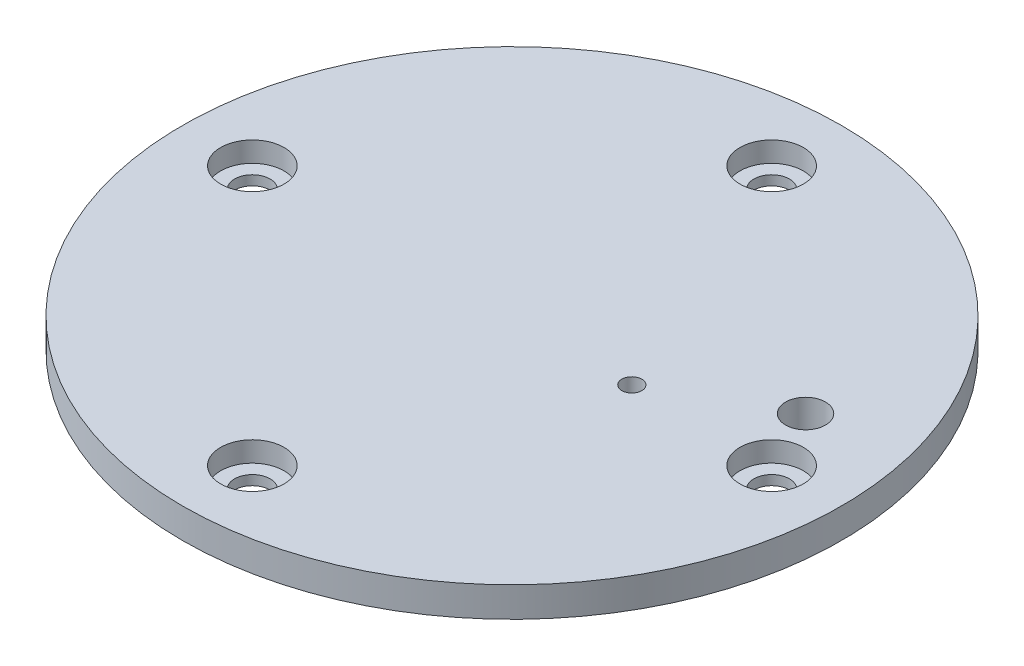
ISO-10303-21;
HEADER;
FILE_DESCRIPTION(('STEP AP214'),'2;1');
FILE_NAME('part.step','',(''),(''),'','','');
FILE_SCHEMA(('AUTOMOTIVE_DESIGN { 1 0 10303 214 1 1 1 1 }'));
ENDSEC;
DATA;
#1=APPLICATION_CONTEXT('core data for automotive mechanical design processes');
#2=APPLICATION_PROTOCOL_DEFINITION('international standard','automotive_design',2000,#1);
#3=PRODUCT_CONTEXT('',#1,'mechanical');
#4=PRODUCT('Part','Part','',(#3));
#5=PRODUCT_RELATED_PRODUCT_CATEGORY('part','',(#4));
#6=PRODUCT_DEFINITION_FORMATION('','',#4);
#7=PRODUCT_DEFINITION_CONTEXT('part definition',#1,'design');
#8=PRODUCT_DEFINITION('design','',#6,#7);
#9=PRODUCT_DEFINITION_SHAPE('','',#8);
#10=(LENGTH_UNIT() NAMED_UNIT(*) SI_UNIT(.MILLI.,.METRE.));
#11=(NAMED_UNIT(*) PLANE_ANGLE_UNIT() SI_UNIT($,.RADIAN.));
#12=(NAMED_UNIT(*) SI_UNIT($,.STERADIAN.) SOLID_ANGLE_UNIT());
#13=UNCERTAINTY_MEASURE_WITH_UNIT(LENGTH_MEASURE(1.E-05),#10,'distance_accuracy_value','');
#14=(GEOMETRIC_REPRESENTATION_CONTEXT(3) GLOBAL_UNCERTAINTY_ASSIGNED_CONTEXT((#13)) GLOBAL_UNIT_ASSIGNED_CONTEXT((#10,
#11,#12)) REPRESENTATION_CONTEXT('',''));
#15=CARTESIAN_POINT('',(0.,0.,0.));
#16=DIRECTION('',(0.,0.,1.));
#17=DIRECTION('',(1.,0.,0.));
#18=AXIS2_PLACEMENT_3D('',#15,#16,#17);
#19=CARTESIAN_POINT('',(0.,1.5,0.));
#20=DIRECTION('',(0.,-1.,0.));
#21=DIRECTION('',(0.,0.,-1.));
#22=AXIS2_PLACEMENT_3D('',#19,#20,#21);
#23=CYLINDRICAL_SURFACE('',#22,16.5);
#24=CARTESIAN_POINT('',(0.,1.5,0.));
#25=DIRECTION('',(0.,1.,0.));
#26=DIRECTION('',(0.,0.,1.));
#27=AXIS2_PLACEMENT_3D('',#24,#25,#26);
#28=CIRCLE('',#27,16.5);
#29=CARTESIAN_POINT('',(0.,1.5,16.5));
#30=VERTEX_POINT('',#29);
#31=EDGE_CURVE('E10',#30,#30,#28,.T.);
#32=ORIENTED_EDGE('',*,*,#31,.F.);
#33=EDGE_LOOP('',(#32));
#34=FACE_BOUND('',#33,.T.);
#35=CARTESIAN_POINT('',(0.,0.,0.));
#36=DIRECTION('',(0.,1.,0.));
#37=DIRECTION('',(0.,0.,1.));
#38=AXIS2_PLACEMENT_3D('',#35,#36,#37);
#39=CIRCLE('',#38,16.5);
#40=CARTESIAN_POINT('',(0.,0.,16.5));
#41=VERTEX_POINT('',#40);
#42=EDGE_CURVE('E36',#41,#41,#39,.T.);
#43=ORIENTED_EDGE('',*,*,#42,.T.);
#44=EDGE_LOOP('',(#43));
#45=FACE_BOUND('',#44,.T.);
#46=ADVANCED_FACE('F33',(#34,#45),#23,.T.);
#47=CARTESIAN_POINT('',(0.,1.5,0.));
#48=DIRECTION('',(0.,1.,0.));
#49=DIRECTION('',(0.,0.,1.));
#50=AXIS2_PLACEMENT_3D('',#47,#48,#49);
#51=PLANE('',#50);
#52=CARTESIAN_POINT('',(11.5911099154688,1.5,-3.10582854123018));
#53=DIRECTION('',(0.,1.,0.));
#54=DIRECTION('',(0.,0.,1.));
#55=AXIS2_PLACEMENT_3D('',#52,#53,#54);
#56=CIRCLE('',#55,1.00000000000001);
#57=CARTESIAN_POINT('',(11.5911099154688,1.5,-2.10582854123017));
#58=VERTEX_POINT('',#57);
#59=EDGE_CURVE('E96',#58,#58,#56,.T.);
#60=ORIENTED_EDGE('',*,*,#59,.F.);
#61=EDGE_LOOP('',(#60));
#62=FACE_BOUND('',#61,.T.);
#63=CARTESIAN_POINT('',(6.,1.5,0.));
#64=DIRECTION('',(0.,-1.,0.));
#65=DIRECTION('',(0.,0.,-1.));
#66=AXIS2_PLACEMENT_3D('',#63,#64,#65);
#67=CIRCLE('',#66,0.500000000000001);
#68=CARTESIAN_POINT('',(6.,1.5,-0.500000000000001));
#69=VERTEX_POINT('',#68);
#70=EDGE_CURVE('E70',#69,#69,#67,.T.);
#71=ORIENTED_EDGE('',*,*,#70,.T.);
#72=EDGE_LOOP('',(#71));
#73=FACE_BOUND('',#72,.T.);
#74=CARTESIAN_POINT('',(0.,1.5,13.));
#75=DIRECTION('',(0.,1.,0.));
#76=DIRECTION('',(1.,0.,0.));
#77=AXIS2_PLACEMENT_3D('',#74,#75,#76);
#78=CIRCLE('',#77,1.5875);
#79=CARTESIAN_POINT('',(1.58750000000005,1.5,13.));
#80=VERTEX_POINT('',#79);
#81=EDGE_CURVE('E74',#80,#80,#78,.T.);
#82=ORIENTED_EDGE('',*,*,#81,.F.);
#83=EDGE_LOOP('',(#82));
#84=FACE_BOUND('',#83,.T.);
#85=CARTESIAN_POINT('',(13.,1.5,0.));
#86=DIRECTION('',(0.,1.,0.));
#87=DIRECTION('',(0.,0.,-1.));
#88=AXIS2_PLACEMENT_3D('',#85,#86,#87);
#89=CIRCLE('',#88,1.5875);
#90=CARTESIAN_POINT('',(13.,1.5,-1.5875));
#91=VERTEX_POINT('',#90);
#92=EDGE_CURVE('E60',#91,#91,#89,.T.);
#93=ORIENTED_EDGE('',*,*,#92,.F.);
#94=EDGE_LOOP('',(#93));
#95=FACE_BOUND('',#94,.T.);
#96=CARTESIAN_POINT('',(-1.36167772214882E-13,1.5,-13.));
#97=DIRECTION('',(0.,1.,0.));
#98=DIRECTION('',(-1.,0.,0.));
#99=AXIS2_PLACEMENT_3D('',#96,#97,#98);
#100=CIRCLE('',#99,1.5875);
#101=CARTESIAN_POINT('',(-1.58750000000014,1.5,-13.));
#102=VERTEX_POINT('',#101);
#103=EDGE_CURVE('E67',#102,#102,#100,.T.);
#104=ORIENTED_EDGE('',*,*,#103,.F.);
#105=EDGE_LOOP('',(#104));
#106=FACE_BOUND('',#105,.T.);
#107=CARTESIAN_POINT('',(-13.,1.5,0.));
#108=DIRECTION('',(0.,1.,0.));
#109=DIRECTION('',(0.,0.,1.));
#110=AXIS2_PLACEMENT_3D('',#107,#108,#109);
#111=CIRCLE('',#110,1.5875);
#112=CARTESIAN_POINT('',(-13.,1.5,1.5875));
#113=VERTEX_POINT('',#112);
#114=EDGE_CURVE('E53',#113,#113,#111,.T.);
#115=ORIENTED_EDGE('',*,*,#114,.F.);
#116=EDGE_LOOP('',(#115));
#117=FACE_BOUND('',#116,.T.);
#118=ORIENTED_EDGE('',*,*,#31,.T.);
#119=EDGE_LOOP('',(#118));
#120=FACE_BOUND('',#119,.T.);
#121=ADVANCED_FACE('F120',(#62,#73,#84,#95,#106,#117,#120),#51,.T.);
#122=CARTESIAN_POINT('',(0.,0.,0.));
#123=DIRECTION('',(0.,1.,0.));
#124=DIRECTION('',(0.,0.,1.));
#125=AXIS2_PLACEMENT_3D('',#122,#123,#124);
#126=PLANE('',#125);
#127=CARTESIAN_POINT('',(11.5911099154688,0.,-3.10582854123018));
#128=DIRECTION('',(0.,1.,0.));
#129=DIRECTION('',(0.,0.,1.));
#130=AXIS2_PLACEMENT_3D('',#127,#128,#129);
#131=CIRCLE('',#130,1.00000000000001);
#132=CARTESIAN_POINT('',(11.5911099154688,0.,-2.10582854123017));
#133=VERTEX_POINT('',#132);
#134=EDGE_CURVE('E101',#133,#133,#131,.T.);
#135=ORIENTED_EDGE('',*,*,#134,.T.);
#136=EDGE_LOOP('',(#135));
#137=FACE_BOUND('',#136,.T.);
#138=CARTESIAN_POINT('',(6.,0.,0.));
#139=DIRECTION('',(0.,-1.,0.));
#140=DIRECTION('',(0.,0.,-1.));
#141=AXIS2_PLACEMENT_3D('',#138,#139,#140);
#142=CIRCLE('',#141,0.500000000000001);
#143=CARTESIAN_POINT('',(6.,0.,-0.500000000000001));
#144=VERTEX_POINT('',#143);
#145=EDGE_CURVE('E93',#144,#144,#142,.T.);
#146=ORIENTED_EDGE('',*,*,#145,.F.);
#147=EDGE_LOOP('',(#146));
#148=FACE_BOUND('',#147,.T.);
#149=CARTESIAN_POINT('',(0.,0.,13.));
#150=DIRECTION('',(0.,1.,0.));
#151=DIRECTION('',(1.,0.,0.));
#152=AXIS2_PLACEMENT_3D('',#149,#150,#151);
#153=CIRCLE('',#152,0.888999999999999);
#154=CARTESIAN_POINT('',(0.889000000000045,0.,13.));
#155=VERTEX_POINT('',#154);
#156=EDGE_CURVE('E88',#155,#155,#153,.T.);
#157=ORIENTED_EDGE('',*,*,#156,.T.);
#158=EDGE_LOOP('',(#157));
#159=FACE_BOUND('',#158,.T.);
#160=CARTESIAN_POINT('',(13.,0.,0.));
#161=DIRECTION('',(0.,1.,0.));
#162=DIRECTION('',(0.,0.,-1.));
#163=AXIS2_PLACEMENT_3D('',#160,#161,#162);
#164=CIRCLE('',#163,0.888999999999999);
#165=CARTESIAN_POINT('',(13.,0.,-0.888999999999999));
#166=VERTEX_POINT('',#165);
#167=EDGE_CURVE('E78',#166,#166,#164,.T.);
#168=ORIENTED_EDGE('',*,*,#167,.T.);
#169=EDGE_LOOP('',(#168));
#170=FACE_BOUND('',#169,.T.);
#171=CARTESIAN_POINT('',(-1.36167772214882E-13,0.,-13.));
#172=DIRECTION('',(0.,1.,0.));
#173=DIRECTION('',(-1.,0.,0.));
#174=AXIS2_PLACEMENT_3D('',#171,#172,#173);
#175=CIRCLE('',#174,0.888999999999999);
#176=CARTESIAN_POINT('',(-0.889000000000135,0.,-13.));
#177=VERTEX_POINT('',#176);
#178=EDGE_CURVE('E64',#177,#177,#175,.T.);
#179=ORIENTED_EDGE('',*,*,#178,.T.);
#180=EDGE_LOOP('',(#179));
#181=FACE_BOUND('',#180,.T.);
#182=CARTESIAN_POINT('',(-13.,0.,0.));
#183=DIRECTION('',(0.,1.,0.));
#184=DIRECTION('',(0.,0.,1.));
#185=AXIS2_PLACEMENT_3D('',#182,#183,#184);
#186=CIRCLE('',#185,0.888999999999999);
#187=CARTESIAN_POINT('',(-13.,0.,0.888999999999999));
#188=VERTEX_POINT('',#187);
#189=EDGE_CURVE('E43',#188,#188,#186,.T.);
#190=ORIENTED_EDGE('',*,*,#189,.T.);
#191=EDGE_LOOP('',(#190));
#192=FACE_BOUND('',#191,.T.);
#193=ORIENTED_EDGE('',*,*,#42,.F.);
#194=EDGE_LOOP('',(#193));
#195=FACE_BOUND('',#194,.T.);
#196=ADVANCED_FACE('F105',(#137,#148,#159,#170,#181,#192,#195),#126,.F.);
#197=CARTESIAN_POINT('',(-13.,1.5,0.));
#198=DIRECTION('',(0.,1.,0.));
#199=DIRECTION('',(0.,0.,1.));
#200=AXIS2_PLACEMENT_3D('',#197,#198,#199);
#201=CYLINDRICAL_SURFACE('',#200,0.888999999999999);
#202=ORIENTED_EDGE('',*,*,#189,.F.);
#203=EDGE_LOOP('',(#202));
#204=FACE_BOUND('',#203,.T.);
#205=CARTESIAN_POINT('',(-13.,0.484,0.));
#206=DIRECTION('',(0.,1.,0.));
#207=DIRECTION('',(0.,0.,1.));
#208=AXIS2_PLACEMENT_3D('',#205,#206,#207);
#209=CIRCLE('',#208,0.888999999999999);
#210=CARTESIAN_POINT('',(-13.,0.484,0.888999999999999));
#211=VERTEX_POINT('',#210);
#212=EDGE_CURVE('E47',#211,#211,#209,.T.);
#213=ORIENTED_EDGE('',*,*,#212,.T.);
#214=EDGE_LOOP('',(#213));
#215=FACE_BOUND('',#214,.T.);
#216=ADVANCED_FACE('F131',(#204,#215),#201,.F.);
#217=CARTESIAN_POINT('',(-12.111,0.484,0.));
#218=DIRECTION('',(0.,-1.,0.));
#219=DIRECTION('',(0.,0.,-1.));
#220=AXIS2_PLACEMENT_3D('',#217,#218,#219);
#221=PLANE('',#220);
#222=ORIENTED_EDGE('',*,*,#212,.F.);
#223=EDGE_LOOP('',(#222));
#224=FACE_BOUND('',#223,.T.);
#225=CARTESIAN_POINT('',(-13.,0.484,0.));
#226=DIRECTION('',(0.,1.,0.));
#227=DIRECTION('',(0.,0.,1.));
#228=AXIS2_PLACEMENT_3D('',#225,#226,#227);
#229=CIRCLE('',#228,1.5875);
#230=CARTESIAN_POINT('',(-13.,0.484,1.5875));
#231=VERTEX_POINT('',#230);
#232=EDGE_CURVE('E50',#231,#231,#229,.T.);
#233=ORIENTED_EDGE('',*,*,#232,.T.);
#234=EDGE_LOOP('',(#233));
#235=FACE_BOUND('',#234,.T.);
#236=ADVANCED_FACE('F135',(#224,#235),#221,.F.);
#237=CARTESIAN_POINT('',(-13.,1.5,0.));
#238=DIRECTION('',(0.,1.,0.));
#239=DIRECTION('',(0.,0.,1.));
#240=AXIS2_PLACEMENT_3D('',#237,#238,#239);
#241=CYLINDRICAL_SURFACE('',#240,1.5875);
#242=ORIENTED_EDGE('',*,*,#232,.F.);
#243=EDGE_LOOP('',(#242));
#244=FACE_BOUND('',#243,.T.);
#245=ORIENTED_EDGE('',*,*,#114,.T.);
#246=EDGE_LOOP('',(#245));
#247=FACE_BOUND('',#246,.T.);
#248=ADVANCED_FACE('F141',(#244,#247),#241,.F.);
#249=CARTESIAN_POINT('',(-1.36167772214882E-13,1.5,-13.));
#250=DIRECTION('',(0.,1.,0.));
#251=DIRECTION('',(-1.,0.,0.));
#252=AXIS2_PLACEMENT_3D('',#249,#250,#251);
#253=CYLINDRICAL_SURFACE('',#252,0.888999999999999);
#254=ORIENTED_EDGE('',*,*,#178,.F.);
#255=EDGE_LOOP('',(#254));
#256=FACE_BOUND('',#255,.T.);
#257=CARTESIAN_POINT('',(-1.36167772214882E-13,0.484,-13.));
#258=DIRECTION('',(0.,1.,0.));
#259=DIRECTION('',(-1.,0.,0.));
#260=AXIS2_PLACEMENT_3D('',#257,#258,#259);
#261=CIRCLE('',#260,0.888999999999999);
#262=CARTESIAN_POINT('',(-0.889000000000135,0.484,-13.));
#263=VERTEX_POINT('',#262);
#264=EDGE_CURVE('E57',#263,#263,#261,.T.);
#265=ORIENTED_EDGE('',*,*,#264,.T.);
#266=EDGE_LOOP('',(#265));
#267=FACE_BOUND('',#266,.T.);
#268=ADVANCED_FACE('F145',(#256,#267),#253,.F.);
#269=CARTESIAN_POINT('',(-1.26855991484188E-13,0.484,-12.111));
#270=DIRECTION('',(0.,-1.,0.));
#271=DIRECTION('',(1.,0.,0.));
#272=AXIS2_PLACEMENT_3D('',#269,#270,#271);
#273=PLANE('',#272);
#274=ORIENTED_EDGE('',*,*,#264,.F.);
#275=EDGE_LOOP('',(#274));
#276=FACE_BOUND('',#275,.T.);
#277=CARTESIAN_POINT('',(-1.36167772214882E-13,0.484,-13.));
#278=DIRECTION('',(0.,1.,0.));
#279=DIRECTION('',(-1.,0.,0.));
#280=AXIS2_PLACEMENT_3D('',#277,#278,#279);
#281=CIRCLE('',#280,1.5875);
#282=CARTESIAN_POINT('',(-1.58750000000013,0.484,-13.));
#283=VERTEX_POINT('',#282);
#284=EDGE_CURVE('E61',#283,#283,#281,.T.);
#285=ORIENTED_EDGE('',*,*,#284,.T.);
#286=EDGE_LOOP('',(#285));
#287=FACE_BOUND('',#286,.T.);
#288=ADVANCED_FACE('F149',(#276,#287),#273,.F.);
#289=CARTESIAN_POINT('',(-1.36167772214882E-13,1.5,-13.));
#290=DIRECTION('',(0.,1.,0.));
#291=DIRECTION('',(-1.,0.,0.));
#292=AXIS2_PLACEMENT_3D('',#289,#290,#291);
#293=CYLINDRICAL_SURFACE('',#292,1.5875);
#294=ORIENTED_EDGE('',*,*,#284,.F.);
#295=EDGE_LOOP('',(#294));
#296=FACE_BOUND('',#295,.T.);
#297=ORIENTED_EDGE('',*,*,#103,.T.);
#298=EDGE_LOOP('',(#297));
#299=FACE_BOUND('',#298,.T.);
#300=ADVANCED_FACE('F153',(#296,#299),#293,.F.);
#301=CARTESIAN_POINT('',(13.,1.5,0.));
#302=DIRECTION('',(0.,1.,0.));
#303=DIRECTION('',(0.,0.,-1.));
#304=AXIS2_PLACEMENT_3D('',#301,#302,#303);
#305=CYLINDRICAL_SURFACE('',#304,0.888999999999999);
#306=ORIENTED_EDGE('',*,*,#167,.F.);
#307=EDGE_LOOP('',(#306));
#308=FACE_BOUND('',#307,.T.);
#309=CARTESIAN_POINT('',(13.,0.484,0.));
#310=DIRECTION('',(0.,1.,0.));
#311=DIRECTION('',(0.,0.,-1.));
#312=AXIS2_PLACEMENT_3D('',#309,#310,#311);
#313=CIRCLE('',#312,0.888999999999999);
#314=CARTESIAN_POINT('',(13.,0.484,-0.888999999999999));
#315=VERTEX_POINT('',#314);
#316=EDGE_CURVE('E71',#315,#315,#313,.T.);
#317=ORIENTED_EDGE('',*,*,#316,.T.);
#318=EDGE_LOOP('',(#317));
#319=FACE_BOUND('',#318,.T.);
#320=ADVANCED_FACE('F157',(#308,#319),#305,.F.);
#321=CARTESIAN_POINT('',(12.111,0.484,0.));
#322=DIRECTION('',(0.,-1.,0.));
#323=DIRECTION('',(0.,0.,1.));
#324=AXIS2_PLACEMENT_3D('',#321,#322,#323);
#325=PLANE('',#324);
#326=ORIENTED_EDGE('',*,*,#316,.F.);
#327=EDGE_LOOP('',(#326));
#328=FACE_BOUND('',#327,.T.);
#329=CARTESIAN_POINT('',(13.,0.484,0.));
#330=DIRECTION('',(0.,1.,0.));
#331=DIRECTION('',(0.,0.,-1.));
#332=AXIS2_PLACEMENT_3D('',#329,#330,#331);
#333=CIRCLE('',#332,1.5875);
#334=CARTESIAN_POINT('',(13.,0.484,-1.5875));
#335=VERTEX_POINT('',#334);
#336=EDGE_CURVE('E75',#335,#335,#333,.T.);
#337=ORIENTED_EDGE('',*,*,#336,.T.);
#338=EDGE_LOOP('',(#337));
#339=FACE_BOUND('',#338,.T.);
#340=ADVANCED_FACE('F161',(#328,#339),#325,.F.);
#341=CARTESIAN_POINT('',(13.,1.5,0.));
#342=DIRECTION('',(0.,1.,0.));
#343=DIRECTION('',(0.,0.,-1.));
#344=AXIS2_PLACEMENT_3D('',#341,#342,#343);
#345=CYLINDRICAL_SURFACE('',#344,1.5875);
#346=ORIENTED_EDGE('',*,*,#336,.F.);
#347=EDGE_LOOP('',(#346));
#348=FACE_BOUND('',#347,.T.);
#349=ORIENTED_EDGE('',*,*,#92,.T.);
#350=EDGE_LOOP('',(#349));
#351=FACE_BOUND('',#350,.T.);
#352=ADVANCED_FACE('F165',(#348,#351),#345,.F.);
#353=CARTESIAN_POINT('',(0.,1.5,13.));
#354=DIRECTION('',(0.,1.,0.));
#355=DIRECTION('',(1.,0.,0.));
#356=AXIS2_PLACEMENT_3D('',#353,#354,#355);
#357=CYLINDRICAL_SURFACE('',#356,0.888999999999999);
#358=ORIENTED_EDGE('',*,*,#156,.F.);
#359=EDGE_LOOP('',(#358));
#360=FACE_BOUND('',#359,.T.);
#361=CARTESIAN_POINT('',(0.,0.484,13.));
#362=DIRECTION('',(0.,1.,0.));
#363=DIRECTION('',(1.,0.,0.));
#364=AXIS2_PLACEMENT_3D('',#361,#362,#363);
#365=CIRCLE('',#364,0.888999999999999);
#366=CARTESIAN_POINT('',(0.889000000000045,0.484,13.));
#367=VERTEX_POINT('',#366);
#368=EDGE_CURVE('E56',#367,#367,#365,.T.);
#369=ORIENTED_EDGE('',*,*,#368,.T.);
#370=EDGE_LOOP('',(#369));
#371=FACE_BOUND('',#370,.T.);
#372=ADVANCED_FACE('F169',(#360,#371),#357,.F.);
#373=CARTESIAN_POINT('',(0.,0.484,12.111));
#374=DIRECTION('',(0.,-1.,0.));
#375=DIRECTION('',(-1.,0.,0.));
#376=AXIS2_PLACEMENT_3D('',#373,#374,#375);
#377=PLANE('',#376);
#378=ORIENTED_EDGE('',*,*,#368,.F.);
#379=EDGE_LOOP('',(#378));
#380=FACE_BOUND('',#379,.T.);
#381=CARTESIAN_POINT('',(0.,0.484,13.));
#382=DIRECTION('',(0.,1.,0.));
#383=DIRECTION('',(1.,0.,0.));
#384=AXIS2_PLACEMENT_3D('',#381,#382,#383);
#385=CIRCLE('',#384,1.5875);
#386=CARTESIAN_POINT('',(1.58750000000004,0.484,13.));
#387=VERTEX_POINT('',#386);
#388=EDGE_CURVE('E85',#387,#387,#385,.T.);
#389=ORIENTED_EDGE('',*,*,#388,.T.);
#390=EDGE_LOOP('',(#389));
#391=FACE_BOUND('',#390,.T.);
#392=ADVANCED_FACE('F173',(#380,#391),#377,.F.);
#393=CARTESIAN_POINT('',(0.,1.5,13.));
#394=DIRECTION('',(0.,1.,0.));
#395=DIRECTION('',(1.,0.,0.));
#396=AXIS2_PLACEMENT_3D('',#393,#394,#395);
#397=CYLINDRICAL_SURFACE('',#396,1.5875);
#398=ORIENTED_EDGE('',*,*,#388,.F.);
#399=EDGE_LOOP('',(#398));
#400=FACE_BOUND('',#399,.T.);
#401=ORIENTED_EDGE('',*,*,#81,.T.);
#402=EDGE_LOOP('',(#401));
#403=FACE_BOUND('',#402,.T.);
#404=ADVANCED_FACE('F116',(#400,#403),#397,.F.);
#405=CARTESIAN_POINT('',(6.,1.5,0.));
#406=DIRECTION('',(0.,-1.,0.));
#407=DIRECTION('',(0.,0.,-1.));
#408=AXIS2_PLACEMENT_3D('',#405,#406,#407);
#409=CYLINDRICAL_SURFACE('',#408,0.500000000000001);
#410=ORIENTED_EDGE('',*,*,#70,.F.);
#411=EDGE_LOOP('',(#410));
#412=FACE_BOUND('',#411,.T.);
#413=ORIENTED_EDGE('',*,*,#145,.T.);
#414=EDGE_LOOP('',(#413));
#415=FACE_BOUND('',#414,.T.);
#416=ADVANCED_FACE('F110',(#412,#415),#409,.F.);
#417=CARTESIAN_POINT('',(11.5911099154688,0.,-3.10582854123018));
#418=DIRECTION('',(0.,1.,0.));
#419=DIRECTION('',(0.,0.,1.));
#420=AXIS2_PLACEMENT_3D('',#417,#418,#419);
#421=CYLINDRICAL_SURFACE('',#420,1.00000000000001);
#422=ORIENTED_EDGE('',*,*,#59,.T.);
#423=EDGE_LOOP('',(#422));
#424=FACE_BOUND('',#423,.T.);
#425=ORIENTED_EDGE('',*,*,#134,.F.);
#426=EDGE_LOOP('',(#425));
#427=FACE_BOUND('',#426,.T.);
#428=ADVANCED_FACE('F108',(#424,#427),#421,.F.);
#429=CLOSED_SHELL('',(#46,#121,#196,#216,#236,#248,#268,#288,#300,#320,#340,#352,#372,#392,#404,
#416,#428));
#430=MANIFOLD_SOLID_BREP('B2',#429);
#431=ADVANCED_BREP_SHAPE_REPRESENTATION('',(#18,#430),#14);
#432=SHAPE_DEFINITION_REPRESENTATION(#9,#431);
ENDSEC;
END-ISO-10303-21;
